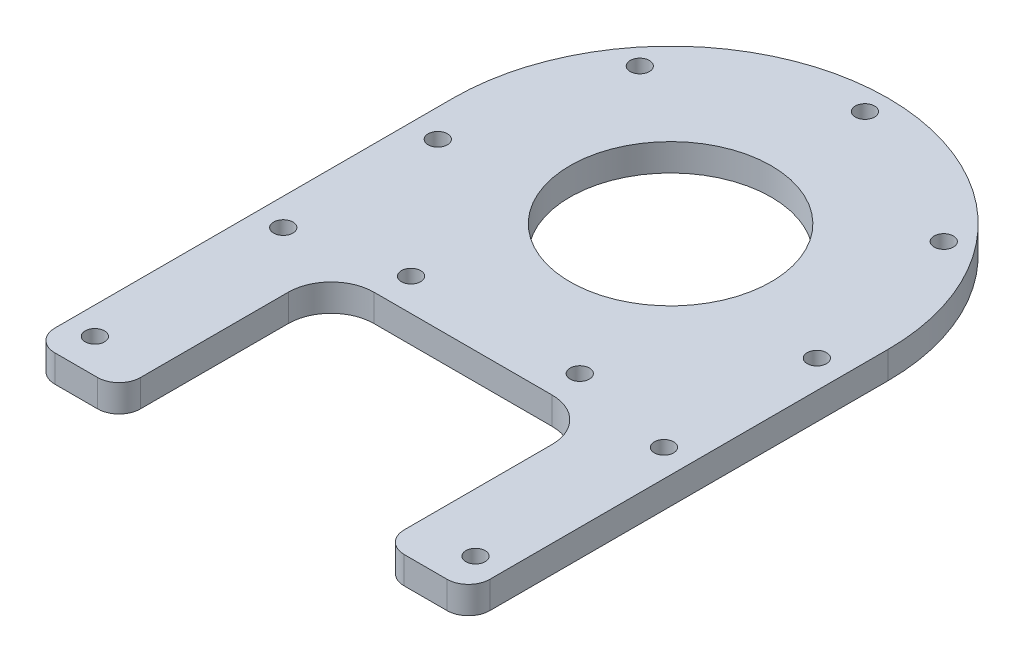
ISO-10303-21;
HEADER;
FILE_DESCRIPTION(('STEP AP214'),'2;1');
FILE_NAME('part.step','',(''),(''),'','','');
FILE_SCHEMA(('AUTOMOTIVE_DESIGN { 1 0 10303 214 1 1 1 1 }'));
ENDSEC;
DATA;
#1=APPLICATION_CONTEXT('core data for automotive mechanical design processes');
#2=APPLICATION_PROTOCOL_DEFINITION('international standard','automotive_design',2000,#1);
#3=PRODUCT_CONTEXT('',#1,'mechanical');
#4=PRODUCT('Part','Part','',(#3));
#5=PRODUCT_RELATED_PRODUCT_CATEGORY('part','',(#4));
#6=PRODUCT_DEFINITION_FORMATION('','',#4);
#7=PRODUCT_DEFINITION_CONTEXT('part definition',#1,'design');
#8=PRODUCT_DEFINITION('design','',#6,#7);
#9=PRODUCT_DEFINITION_SHAPE('','',#8);
#10=(LENGTH_UNIT() NAMED_UNIT(*) SI_UNIT(.MILLI.,.METRE.));
#11=(NAMED_UNIT(*) PLANE_ANGLE_UNIT() SI_UNIT($,.RADIAN.));
#12=(NAMED_UNIT(*) SI_UNIT($,.STERADIAN.) SOLID_ANGLE_UNIT());
#13=UNCERTAINTY_MEASURE_WITH_UNIT(LENGTH_MEASURE(1.E-05),#10,'distance_accuracy_value','');
#14=(GEOMETRIC_REPRESENTATION_CONTEXT(3) GLOBAL_UNCERTAINTY_ASSIGNED_CONTEXT((#13)) GLOBAL_UNIT_ASSIGNED_CONTEXT((#10,
#11,#12)) REPRESENTATION_CONTEXT('',''));
#15=CARTESIAN_POINT('',(0.,0.,0.));
#16=DIRECTION('',(0.,0.,1.));
#17=DIRECTION('',(1.,0.,0.));
#18=AXIS2_PLACEMENT_3D('',#15,#16,#17);
#19=CARTESIAN_POINT('',(0.,6.35,24.0717945408006));
#20=DIRECTION('',(0.,0.,-1.));
#21=DIRECTION('',(-1.,0.,0.));
#22=AXIS2_PLACEMENT_3D('',#19,#20,#21);
#23=PLANE('',#22);
#24=DIRECTION('',(1.,0.,0.));
#25=VECTOR('',#24,1.);
#26=CARTESIAN_POINT('',(0.,0.,24.0717945408006));
#27=LINE('',#26,#25);
#28=CARTESIAN_POINT('',(-20.8,0.,24.0717945408006));
#29=VERTEX_POINT('',#28);
#30=CARTESIAN_POINT('',(20.8,0.,24.0717945408006));
#31=VERTEX_POINT('',#30);
#32=EDGE_CURVE('E183',#29,#31,#27,.T.);
#33=ORIENTED_EDGE('',*,*,#32,.T.);
#34=DIRECTION('',(0.,-1.,0.));
#35=VECTOR('',#34,1.);
#36=CARTESIAN_POINT('',(20.8,6.35,24.0717945408006));
#37=LINE('',#36,#35);
#38=CARTESIAN_POINT('',(20.8,6.35,24.0717945408006));
#39=VERTEX_POINT('',#38);
#40=EDGE_CURVE('E210',#31,#39,#37,.F.);
#41=ORIENTED_EDGE('',*,*,#40,.T.);
#42=DIRECTION('',(1.,0.,0.));
#43=VECTOR('',#42,1.);
#44=CARTESIAN_POINT('',(0.,6.35,24.0717945408006));
#45=LINE('',#44,#43);
#46=CARTESIAN_POINT('',(-20.8,6.35,24.0717945408006));
#47=VERTEX_POINT('',#46);
#48=EDGE_CURVE('E203',#47,#39,#45,.T.);
#49=ORIENTED_EDGE('',*,*,#48,.F.);
#50=DIRECTION('',(0.,-1.,0.));
#51=VECTOR('',#50,1.);
#52=CARTESIAN_POINT('',(-20.8,0.,24.0717945408006));
#53=LINE('',#52,#51);
#54=EDGE_CURVE('E207',#47,#29,#53,.T.);
#55=ORIENTED_EDGE('',*,*,#54,.T.);
#56=EDGE_LOOP('',(#33,#41,#49,#55));
#57=FACE_BOUND('',#56,.T.);
#58=ADVANCED_FACE('F47',(#57),#23,.F.);
#59=CARTESIAN_POINT('',(30.8,6.35,0.));
#60=DIRECTION('',(1.,0.,0.));
#61=DIRECTION('',(0.,0.,-1.));
#62=AXIS2_PLACEMENT_3D('',#59,#60,#61);
#63=PLANE('',#62);
#64=DIRECTION('',(0.,0.,1.));
#65=VECTOR('',#64,1.);
#66=CARTESIAN_POINT('',(30.8,0.,0.));
#67=LINE('',#66,#65);
#68=CARTESIAN_POINT('',(30.8,0.,34.0717945408006));
#69=VERTEX_POINT('',#68);
#70=CARTESIAN_POINT('',(30.8,0.,68.6017945408006));
#71=VERTEX_POINT('',#70);
#72=EDGE_CURVE('E186',#69,#71,#67,.T.);
#73=ORIENTED_EDGE('',*,*,#72,.T.);
#74=DIRECTION('',(0.,-1.,0.));
#75=VECTOR('',#74,1.);
#76=CARTESIAN_POINT('',(30.8,6.35,68.6017945408006));
#77=LINE('',#76,#75);
#78=CARTESIAN_POINT('',(30.8,6.35,68.6017945408006));
#79=VERTEX_POINT('',#78);
#80=EDGE_CURVE('E290',#71,#79,#77,.F.);
#81=ORIENTED_EDGE('',*,*,#80,.T.);
#82=DIRECTION('',(0.,0.,1.));
#83=VECTOR('',#82,1.);
#84=CARTESIAN_POINT('',(30.8,6.35,0.));
#85=LINE('',#84,#83);
#86=CARTESIAN_POINT('',(30.8,6.35,34.0717945408006));
#87=VERTEX_POINT('',#86);
#88=EDGE_CURVE('E331',#87,#79,#85,.T.);
#89=ORIENTED_EDGE('',*,*,#88,.F.);
#90=DIRECTION('',(0.,-1.,0.));
#91=VECTOR('',#90,1.);
#92=CARTESIAN_POINT('',(30.8,0.,34.0717945408006));
#93=LINE('',#92,#91);
#94=EDGE_CURVE('E168',#87,#69,#93,.T.);
#95=ORIENTED_EDGE('',*,*,#94,.T.);
#96=EDGE_LOOP('',(#73,#81,#89,#95));
#97=FACE_BOUND('',#96,.T.);
#98=ADVANCED_FACE('F341',(#97),#63,.F.);
#99=CARTESIAN_POINT('',(0.,6.35,73.6017945408006));
#100=DIRECTION('',(0.,0.,-1.));
#101=DIRECTION('',(-1.,0.,0.));
#102=AXIS2_PLACEMENT_3D('',#99,#100,#101);
#103=PLANE('',#102);
#104=DIRECTION('',(1.,0.,0.));
#105=VECTOR('',#104,1.);
#106=CARTESIAN_POINT('',(0.,6.35,73.6017945408006));
#107=LINE('',#106,#105);
#108=CARTESIAN_POINT('',(35.8,6.35,73.6017945408006));
#109=VERTEX_POINT('',#108);
#110=CARTESIAN_POINT('',(45.8,6.35,73.6017945408006));
#111=VERTEX_POINT('',#110);
#112=EDGE_CURVE('E159',#109,#111,#107,.T.);
#113=ORIENTED_EDGE('',*,*,#112,.F.);
#114=DIRECTION('',(0.,-1.,0.));
#115=VECTOR('',#114,1.);
#116=CARTESIAN_POINT('',(35.8,6.35,73.6017945408006));
#117=LINE('',#116,#115);
#118=CARTESIAN_POINT('',(35.8,0.,73.6017945408006));
#119=VERTEX_POINT('',#118);
#120=EDGE_CURVE('E279',#109,#119,#117,.T.);
#121=ORIENTED_EDGE('',*,*,#120,.T.);
#122=DIRECTION('',(1.,0.,0.));
#123=VECTOR('',#122,1.);
#124=CARTESIAN_POINT('',(0.,0.,73.6017945408006));
#125=LINE('',#124,#123);
#126=CARTESIAN_POINT('',(45.8,0.,73.6017945408006));
#127=VERTEX_POINT('',#126);
#128=EDGE_CURVE('E190',#119,#127,#125,.T.);
#129=ORIENTED_EDGE('',*,*,#128,.T.);
#130=DIRECTION('',(0.,-1.,0.));
#131=VECTOR('',#130,1.);
#132=CARTESIAN_POINT('',(45.8,6.35,73.6017945408006));
#133=LINE('',#132,#131);
#134=EDGE_CURVE('E224',#127,#111,#133,.F.);
#135=ORIENTED_EDGE('',*,*,#134,.T.);
#136=EDGE_LOOP('',(#113,#121,#129,#135));
#137=FACE_BOUND('',#136,.T.);
#138=ADVANCED_FACE('F455',(#137),#103,.F.);
#139=CARTESIAN_POINT('',(50.8,6.35,0.));
#140=DIRECTION('',(-1.,0.,0.));
#141=DIRECTION('',(0.,0.,1.));
#142=AXIS2_PLACEMENT_3D('',#139,#140,#141);
#143=PLANE('',#142);
#144=DIRECTION('',(0.,0.,-1.));
#145=VECTOR('',#144,1.);
#146=CARTESIAN_POINT('',(50.8,6.35,0.));
#147=LINE('',#146,#145);
#148=CARTESIAN_POINT('',(50.8,6.35,68.6017945408006));
#149=VERTEX_POINT('',#148);
#150=CARTESIAN_POINT('',(50.8,6.35,-24.3982054591994));
#151=VERTEX_POINT('',#150);
#152=EDGE_CURVE('E146',#149,#151,#147,.T.);
#153=ORIENTED_EDGE('',*,*,#152,.F.);
#154=DIRECTION('',(0.,-1.,0.));
#155=VECTOR('',#154,1.);
#156=CARTESIAN_POINT('',(50.8,6.35,68.6017945408006));
#157=LINE('',#156,#155);
#158=CARTESIAN_POINT('',(50.8,0.,68.6017945408006));
#159=VERTEX_POINT('',#158);
#160=EDGE_CURVE('E298',#149,#159,#157,.T.);
#161=ORIENTED_EDGE('',*,*,#160,.T.);
#162=DIRECTION('',(0.,0.,-1.));
#163=VECTOR('',#162,1.);
#164=CARTESIAN_POINT('',(50.8,0.,0.));
#165=LINE('',#164,#163);
#166=CARTESIAN_POINT('',(50.8,0.,-24.3982054591994));
#167=VERTEX_POINT('',#166);
#168=EDGE_CURVE('E165',#159,#167,#165,.T.);
#169=ORIENTED_EDGE('',*,*,#168,.T.);
#170=DIRECTION('',(0.,-1.,0.));
#171=VECTOR('',#170,1.);
#172=CARTESIAN_POINT('',(50.8,6.35,-24.3982054591994));
#173=LINE('',#172,#171);
#174=EDGE_CURVE('E162',#151,#167,#173,.T.);
#175=ORIENTED_EDGE('',*,*,#174,.F.);
#176=EDGE_LOOP('',(#153,#161,#169,#175));
#177=FACE_BOUND('',#176,.T.);
#178=ADVANCED_FACE('F163',(#177),#143,.F.);
#179=CARTESIAN_POINT('',(0.,6.35,-24.3982054591994));
#180=DIRECTION('',(0.,-1.,0.));
#181=DIRECTION('',(0.,0.,-1.));
#182=AXIS2_PLACEMENT_3D('',#179,#180,#181);
#183=CYLINDRICAL_SURFACE('',#182,50.8);
#184=CARTESIAN_POINT('',(0.,0.,-24.3982054591994));
#185=DIRECTION('',(0.,1.,0.));
#186=DIRECTION('',(0.,0.,1.));
#187=AXIS2_PLACEMENT_3D('',#184,#185,#186);
#188=CIRCLE('',#187,50.8);
#189=CARTESIAN_POINT('',(-50.8,0.,-24.3982054591994));
#190=VERTEX_POINT('',#189);
#191=EDGE_CURVE('E194',#167,#190,#188,.T.);
#192=ORIENTED_EDGE('',*,*,#191,.T.);
#193=DIRECTION('',(0.,-1.,0.));
#194=VECTOR('',#193,1.);
#195=CARTESIAN_POINT('',(-50.8,6.35,-24.3982054591994));
#196=LINE('',#195,#194);
#197=CARTESIAN_POINT('',(-50.8,6.35,-24.3982054591994));
#198=VERTEX_POINT('',#197);
#199=EDGE_CURVE('E169',#198,#190,#196,.T.);
#200=ORIENTED_EDGE('',*,*,#199,.F.);
#201=CARTESIAN_POINT('',(0.,6.35,-24.3982054591994));
#202=DIRECTION('',(0.,1.,0.));
#203=DIRECTION('',(0.,0.,1.));
#204=AXIS2_PLACEMENT_3D('',#201,#202,#203);
#205=CIRCLE('',#204,50.8);
#206=EDGE_CURVE('E151',#151,#198,#205,.T.);
#207=ORIENTED_EDGE('',*,*,#206,.F.);
#208=ORIENTED_EDGE('',*,*,#174,.T.);
#209=EDGE_LOOP('',(#192,#200,#207,#208));
#210=FACE_BOUND('',#209,.T.);
#211=ADVANCED_FACE('F171',(#210),#183,.T.);
#212=CARTESIAN_POINT('',(-50.8,6.35,0.));
#213=DIRECTION('',(1.,0.,0.));
#214=DIRECTION('',(0.,0.,-1.));
#215=AXIS2_PLACEMENT_3D('',#212,#213,#214);
#216=PLANE('',#215);
#217=DIRECTION('',(0.,0.,1.));
#218=VECTOR('',#217,1.);
#219=CARTESIAN_POINT('',(-50.8,0.,0.));
#220=LINE('',#219,#218);
#221=CARTESIAN_POINT('',(-50.8,0.,68.6017945408006));
#222=VERTEX_POINT('',#221);
#223=EDGE_CURVE('E196',#190,#222,#220,.T.);
#224=ORIENTED_EDGE('',*,*,#223,.T.);
#225=DIRECTION('',(0.,-1.,0.));
#226=VECTOR('',#225,1.);
#227=CARTESIAN_POINT('',(-50.8,6.35,68.6017945408006));
#228=LINE('',#227,#226);
#229=CARTESIAN_POINT('',(-50.8,6.35,68.6017945408006));
#230=VERTEX_POINT('',#229);
#231=EDGE_CURVE('E11',#222,#230,#228,.F.);
#232=ORIENTED_EDGE('',*,*,#231,.T.);
#233=DIRECTION('',(0.,0.,1.));
#234=VECTOR('',#233,1.);
#235=CARTESIAN_POINT('',(-50.8,6.35,0.));
#236=LINE('',#235,#234);
#237=EDGE_CURVE('E174',#198,#230,#236,.T.);
#238=ORIENTED_EDGE('',*,*,#237,.F.);
#239=ORIENTED_EDGE('',*,*,#199,.T.);
#240=EDGE_LOOP('',(#224,#232,#238,#239));
#241=FACE_BOUND('',#240,.T.);
#242=ADVANCED_FACE('F476',(#241),#216,.F.);
#243=CARTESIAN_POINT('',(0.,6.35,73.6017945408006));
#244=DIRECTION('',(0.,0.,-1.));
#245=DIRECTION('',(-1.,0.,0.));
#246=AXIS2_PLACEMENT_3D('',#243,#244,#245);
#247=PLANE('',#246);
#248=DIRECTION('',(1.,0.,0.));
#249=VECTOR('',#248,1.);
#250=CARTESIAN_POINT('',(0.,0.,73.6017945408006));
#251=LINE('',#250,#249);
#252=CARTESIAN_POINT('',(-45.8,0.,73.6017945408006));
#253=VERTEX_POINT('',#252);
#254=CARTESIAN_POINT('',(-35.8,0.,73.6017945408006));
#255=VERTEX_POINT('',#254);
#256=EDGE_CURVE('E199',#253,#255,#251,.T.);
#257=ORIENTED_EDGE('',*,*,#256,.T.);
#258=DIRECTION('',(0.,-1.,0.));
#259=VECTOR('',#258,1.);
#260=CARTESIAN_POINT('',(-35.8,6.35,73.6017945408006));
#261=LINE('',#260,#259);
#262=CARTESIAN_POINT('',(-35.8,6.35,73.6017945408006));
#263=VERTEX_POINT('',#262);
#264=EDGE_CURVE('E55',#255,#263,#261,.F.);
#265=ORIENTED_EDGE('',*,*,#264,.T.);
#266=DIRECTION('',(1.,0.,0.));
#267=VECTOR('',#266,1.);
#268=CARTESIAN_POINT('',(0.,6.35,73.6017945408006));
#269=LINE('',#268,#267);
#270=CARTESIAN_POINT('',(-45.8,6.35,73.6017945408006));
#271=VERTEX_POINT('',#270);
#272=EDGE_CURVE('E176',#271,#263,#269,.T.);
#273=ORIENTED_EDGE('',*,*,#272,.F.);
#274=DIRECTION('',(0.,-1.,0.));
#275=VECTOR('',#274,1.);
#276=CARTESIAN_POINT('',(-45.8,6.35,73.6017945408006));
#277=LINE('',#276,#275);
#278=EDGE_CURVE('E303',#271,#253,#277,.T.);
#279=ORIENTED_EDGE('',*,*,#278,.T.);
#280=EDGE_LOOP('',(#257,#265,#273,#279));
#281=FACE_BOUND('',#280,.T.);
#282=ADVANCED_FACE('F307',(#281),#247,.F.);
#283=CARTESIAN_POINT('',(-30.8,6.35,0.));
#284=DIRECTION('',(-1.,0.,0.));
#285=DIRECTION('',(0.,0.,1.));
#286=AXIS2_PLACEMENT_3D('',#283,#284,#285);
#287=PLANE('',#286);
#288=DIRECTION('',(0.,0.,-1.));
#289=VECTOR('',#288,1.);
#290=CARTESIAN_POINT('',(-30.8,6.35,0.));
#291=LINE('',#290,#289);
#292=CARTESIAN_POINT('',(-30.8,6.35,68.6017945408006));
#293=VERTEX_POINT('',#292);
#294=CARTESIAN_POINT('',(-30.8,6.35,34.0717945408006));
#295=VERTEX_POINT('',#294);
#296=EDGE_CURVE('E181',#293,#295,#291,.T.);
#297=ORIENTED_EDGE('',*,*,#296,.F.);
#298=DIRECTION('',(0.,-1.,0.));
#299=VECTOR('',#298,1.);
#300=CARTESIAN_POINT('',(-30.8,6.35,68.6017945408006));
#301=LINE('',#300,#299);
#302=CARTESIAN_POINT('',(-30.8,0.,68.6017945408006));
#303=VERTEX_POINT('',#302);
#304=EDGE_CURVE('E300',#293,#303,#301,.T.);
#305=ORIENTED_EDGE('',*,*,#304,.T.);
#306=DIRECTION('',(0.,0.,-1.));
#307=VECTOR('',#306,1.);
#308=CARTESIAN_POINT('',(-30.8,0.,0.));
#309=LINE('',#308,#307);
#310=CARTESIAN_POINT('',(-30.8,0.,34.0717945408006));
#311=VERTEX_POINT('',#310);
#312=EDGE_CURVE('E201',#303,#311,#309,.T.);
#313=ORIENTED_EDGE('',*,*,#312,.T.);
#314=DIRECTION('',(0.,-1.,0.));
#315=VECTOR('',#314,1.);
#316=CARTESIAN_POINT('',(-30.8,6.35,34.0717945408006));
#317=LINE('',#316,#315);
#318=EDGE_CURVE('E212',#311,#295,#317,.F.);
#319=ORIENTED_EDGE('',*,*,#318,.T.);
#320=EDGE_LOOP('',(#297,#305,#313,#319));
#321=FACE_BOUND('',#320,.T.);
#322=ADVANCED_FACE('F320',(#321),#287,.F.);
#323=CARTESIAN_POINT('',(0.,6.35,0.));
#324=DIRECTION('',(0.,1.,0.));
#325=DIRECTION('',(0.,0.,1.));
#326=AXIS2_PLACEMENT_3D('',#323,#324,#325);
#327=PLANE('',#326);
#328=CARTESIAN_POINT('',(0.,6.35,-24.3982054591994));
#329=DIRECTION('',(0.,-1.,0.));
#330=DIRECTION('',(0.,0.,-1.));
#331=AXIS2_PLACEMENT_3D('',#328,#329,#330);
#332=CIRCLE('',#331,23.5);
#333=CARTESIAN_POINT('',(0.,6.35,-47.8982054591995));
#334=VERTEX_POINT('',#333);
#335=EDGE_CURVE('E390',#334,#334,#332,.T.);
#336=ORIENTED_EDGE('',*,*,#335,.T.);
#337=EDGE_LOOP('',(#336));
#338=FACE_BOUND('',#337,.T.);
#339=CARTESIAN_POINT('',(-44.45,6.35,65.6017945408006));
#340=DIRECTION('',(0.,1.,0.));
#341=DIRECTION('',(0.,0.,1.));
#342=AXIS2_PLACEMENT_3D('',#339,#340,#341);
#343=CIRCLE('',#342,2.24999999999999);
#344=CARTESIAN_POINT('',(-44.45,6.35,67.8517945408006));
#345=VERTEX_POINT('',#344);
#346=EDGE_CURVE('E273',#345,#345,#343,.T.);
#347=ORIENTED_EDGE('',*,*,#346,.F.);
#348=EDGE_LOOP('',(#347));
#349=FACE_BOUND('',#348,.T.);
#350=CARTESIAN_POINT('',(44.45,6.35,65.6017945408006));
#351=DIRECTION('',(0.,1.,0.));
#352=DIRECTION('',(0.,0.,1.));
#353=AXIS2_PLACEMENT_3D('',#350,#351,#352);
#354=CIRCLE('',#353,2.24999999999999);
#355=CARTESIAN_POINT('',(44.45,6.35,67.8517945408006));
#356=VERTEX_POINT('',#355);
#357=EDGE_CURVE('E268',#356,#356,#354,.T.);
#358=ORIENTED_EDGE('',*,*,#357,.F.);
#359=EDGE_LOOP('',(#358));
#360=FACE_BOUND('',#359,.T.);
#361=CARTESIAN_POINT('',(-44.45,6.35,21.6017945408006));
#362=DIRECTION('',(0.,1.,0.));
#363=DIRECTION('',(0.,0.,1.));
#364=AXIS2_PLACEMENT_3D('',#361,#362,#363);
#365=CIRCLE('',#364,2.24999999999999);
#366=CARTESIAN_POINT('',(-44.45,6.35,23.8517945408005));
#367=VERTEX_POINT('',#366);
#368=EDGE_CURVE('E263',#367,#367,#365,.T.);
#369=ORIENTED_EDGE('',*,*,#368,.F.);
#370=EDGE_LOOP('',(#369));
#371=FACE_BOUND('',#370,.T.);
#372=CARTESIAN_POINT('',(44.45,6.35,21.6017945408006));
#373=DIRECTION('',(0.,1.,0.));
#374=DIRECTION('',(0.,0.,1.));
#375=AXIS2_PLACEMENT_3D('',#372,#373,#374);
#376=CIRCLE('',#375,2.24999999999999);
#377=CARTESIAN_POINT('',(44.45,6.35,23.8517945408005));
#378=VERTEX_POINT('',#377);
#379=EDGE_CURVE('E258',#378,#378,#376,.T.);
#380=ORIENTED_EDGE('',*,*,#379,.F.);
#381=EDGE_LOOP('',(#380));
#382=FACE_BOUND('',#381,.T.);
#383=CARTESIAN_POINT('',(19.6983217559375,6.35,16.5057811435702));
#384=DIRECTION('',(0.,1.,0.));
#385=DIRECTION('',(0.,0.,1.));
#386=AXIS2_PLACEMENT_3D('',#383,#384,#385);
#387=CIRCLE('',#386,2.24999999999999);
#388=CARTESIAN_POINT('',(19.6983217559375,6.35,18.7557811435702));
#389=VERTEX_POINT('',#388);
#390=EDGE_CURVE('E253',#389,#389,#387,.T.);
#391=ORIENTED_EDGE('',*,*,#390,.F.);
#392=EDGE_LOOP('',(#391));
#393=FACE_BOUND('',#392,.T.);
#394=CARTESIAN_POINT('',(-19.6983217559369,6.35,16.5057811435705));
#395=DIRECTION('',(0.,1.,0.));
#396=DIRECTION('',(0.,0.,1.));
#397=AXIS2_PLACEMENT_3D('',#394,#395,#396);
#398=CIRCLE('',#397,2.24999999999999);
#399=CARTESIAN_POINT('',(-19.6983217559369,6.35,18.7557811435705));
#400=VERTEX_POINT('',#399);
#401=EDGE_CURVE('E248',#400,#400,#398,.T.);
#402=ORIENTED_EDGE('',*,*,#401,.F.);
#403=EDGE_LOOP('',(#402));
#404=FACE_BOUND('',#403,.T.);
#405=CARTESIAN_POINT('',(-44.2617272130547,6.35,-14.2957550575826));
#406=DIRECTION('',(0.,1.,0.));
#407=DIRECTION('',(0.,0.,1.));
#408=AXIS2_PLACEMENT_3D('',#405,#406,#407);
#409=CIRCLE('',#408,2.24999999999999);
#410=CARTESIAN_POINT('',(-44.2617272130547,6.35,-12.0457550575826));
#411=VERTEX_POINT('',#410);
#412=EDGE_CURVE('E243',#411,#411,#409,.T.);
#413=ORIENTED_EDGE('',*,*,#412,.F.);
#414=EDGE_LOOP('',(#413));
#415=FACE_BOUND('',#414,.T.);
#416=CARTESIAN_POINT('',(-35.4951493040486,6.35,-52.7046424635859));
#417=DIRECTION('',(0.,1.,0.));
#418=DIRECTION('',(0.,0.,1.));
#419=AXIS2_PLACEMENT_3D('',#416,#417,#418);
#420=CIRCLE('',#419,2.24999999999999);
#421=CARTESIAN_POINT('',(-35.4951493040486,6.35,-50.4546424635859));
#422=VERTEX_POINT('',#421);
#423=EDGE_CURVE('E238',#422,#422,#420,.T.);
#424=ORIENTED_EDGE('',*,*,#423,.F.);
#425=EDGE_LOOP('',(#424));
#426=FACE_BOUND('',#425,.T.);
#427=CARTESIAN_POINT('',(0.,6.35,-69.7982054591995));
#428=DIRECTION('',(0.,1.,0.));
#429=DIRECTION('',(0.,0.,1.));
#430=AXIS2_PLACEMENT_3D('',#427,#428,#429);
#431=CIRCLE('',#430,2.24999999999999);
#432=CARTESIAN_POINT('',(0.,6.35,-67.5482054591995));
#433=VERTEX_POINT('',#432);
#434=EDGE_CURVE('E233',#433,#433,#431,.T.);
#435=ORIENTED_EDGE('',*,*,#434,.F.);
#436=EDGE_LOOP('',(#435));
#437=FACE_BOUND('',#436,.T.);
#438=CARTESIAN_POINT('',(35.4951493040482,6.35,-52.7046424635864));
#439=DIRECTION('',(0.,1.,0.));
#440=DIRECTION('',(0.,0.,1.));
#441=AXIS2_PLACEMENT_3D('',#438,#439,#440);
#442=CIRCLE('',#441,2.24999999999999);
#443=CARTESIAN_POINT('',(35.4951493040482,6.35,-50.4546424635864));
#444=VERTEX_POINT('',#443);
#445=EDGE_CURVE('E228',#444,#444,#442,.T.);
#446=ORIENTED_EDGE('',*,*,#445,.F.);
#447=EDGE_LOOP('',(#446));
#448=FACE_BOUND('',#447,.T.);
#449=CARTESIAN_POINT('',(44.2617272130549,6.35,-14.2957550575832));
#450=DIRECTION('',(0.,1.,0.));
#451=DIRECTION('',(0.,0.,1.));
#452=AXIS2_PLACEMENT_3D('',#449,#450,#451);
#453=CIRCLE('',#452,2.24999999999999);
#454=CARTESIAN_POINT('',(44.2617272130549,6.35,-12.0457550575832));
#455=VERTEX_POINT('',#454);
#456=EDGE_CURVE('E187',#455,#455,#453,.T.);
#457=ORIENTED_EDGE('',*,*,#456,.F.);
#458=EDGE_LOOP('',(#457));
#459=FACE_BOUND('',#458,.T.);
#460=ORIENTED_EDGE('',*,*,#88,.T.);
#461=CARTESIAN_POINT('',(35.8,6.35,68.6017945408006));
#462=DIRECTION('',(0.,1.,0.));
#463=DIRECTION('',(0.,0.,1.));
#464=AXIS2_PLACEMENT_3D('',#461,#462,#463);
#465=CIRCLE('',#464,5.);
#466=EDGE_CURVE('E296',#79,#109,#465,.T.);
#467=ORIENTED_EDGE('',*,*,#466,.T.);
#468=ORIENTED_EDGE('',*,*,#112,.T.);
#469=CARTESIAN_POINT('',(45.8,6.35,68.6017945408006));
#470=DIRECTION('',(0.,1.,0.));
#471=DIRECTION('',(0.,0.,1.));
#472=AXIS2_PLACEMENT_3D('',#469,#470,#471);
#473=CIRCLE('',#472,5.);
#474=EDGE_CURVE('E155',#111,#149,#473,.T.);
#475=ORIENTED_EDGE('',*,*,#474,.T.);
#476=ORIENTED_EDGE('',*,*,#152,.T.);
#477=ORIENTED_EDGE('',*,*,#206,.T.);
#478=ORIENTED_EDGE('',*,*,#237,.T.);
#479=CARTESIAN_POINT('',(-45.8,6.35,68.6017945408006));
#480=DIRECTION('',(0.,1.,0.));
#481=DIRECTION('',(0.,0.,1.));
#482=AXIS2_PLACEMENT_3D('',#479,#480,#481);
#483=CIRCLE('',#482,5.);
#484=EDGE_CURVE('E68',#230,#271,#483,.T.);
#485=ORIENTED_EDGE('',*,*,#484,.T.);
#486=ORIENTED_EDGE('',*,*,#272,.T.);
#487=CARTESIAN_POINT('',(-35.8,6.35,68.6017945408006));
#488=DIRECTION('',(0.,1.,0.));
#489=DIRECTION('',(0.,0.,1.));
#490=AXIS2_PLACEMENT_3D('',#487,#488,#489);
#491=CIRCLE('',#490,5.);
#492=EDGE_CURVE('E293',#263,#293,#491,.T.);
#493=ORIENTED_EDGE('',*,*,#492,.T.);
#494=ORIENTED_EDGE('',*,*,#296,.T.);
#495=CARTESIAN_POINT('',(-20.8,6.35,34.0717945408006));
#496=DIRECTION('',(0.,1.,0.));
#497=DIRECTION('',(0.,0.,1.));
#498=AXIS2_PLACEMENT_3D('',#495,#496,#497);
#499=CIRCLE('',#498,10.);
#500=EDGE_CURVE('E222',#295,#47,#499,.F.);
#501=ORIENTED_EDGE('',*,*,#500,.T.);
#502=ORIENTED_EDGE('',*,*,#48,.T.);
#503=CARTESIAN_POINT('',(20.8,6.35,34.0717945408006));
#504=DIRECTION('',(0.,1.,0.));
#505=DIRECTION('',(0.,0.,1.));
#506=AXIS2_PLACEMENT_3D('',#503,#504,#505);
#507=CIRCLE('',#506,10.);
#508=EDGE_CURVE('E217',#39,#87,#507,.F.);
#509=ORIENTED_EDGE('',*,*,#508,.T.);
#510=EDGE_LOOP('',(#460,#467,#468,#475,#476,#477,#478,#485,#486,#493,#494,#501,#502,#509));
#511=FACE_BOUND('',#510,.T.);
#512=ADVANCED_FACE('F149',(#338,#349,#360,#371,#382,#393,#404,#415,#426,#437,#448,#459,#511),
#327,.T.);
#513=CARTESIAN_POINT('',(0.,0.,0.));
#514=DIRECTION('',(0.,1.,0.));
#515=DIRECTION('',(0.,0.,1.));
#516=AXIS2_PLACEMENT_3D('',#513,#514,#515);
#517=PLANE('',#516);
#518=CARTESIAN_POINT('',(0.,0.,-24.3982054591994));
#519=DIRECTION('',(0.,-1.,0.));
#520=DIRECTION('',(0.,0.,-1.));
#521=AXIS2_PLACEMENT_3D('',#518,#519,#520);
#522=CIRCLE('',#521,23.5);
#523=CARTESIAN_POINT('',(0.,0.,-47.8982054591995));
#524=VERTEX_POINT('',#523);
#525=EDGE_CURVE('E391',#524,#524,#522,.T.);
#526=ORIENTED_EDGE('',*,*,#525,.F.);
#527=EDGE_LOOP('',(#526));
#528=FACE_BOUND('',#527,.T.);
#529=CARTESIAN_POINT('',(-44.45,0.,65.6017945408006));
#530=DIRECTION('',(0.,-1.,0.));
#531=DIRECTION('',(0.,0.,-1.));
#532=AXIS2_PLACEMENT_3D('',#529,#530,#531);
#533=CIRCLE('',#532,4.7);
#534=CARTESIAN_POINT('',(-44.45,0.,60.9017945408006));
#535=VERTEX_POINT('',#534);
#536=EDGE_CURVE('E387',#535,#535,#533,.T.);
#537=ORIENTED_EDGE('',*,*,#536,.F.);
#538=EDGE_LOOP('',(#537));
#539=FACE_BOUND('',#538,.T.);
#540=CARTESIAN_POINT('',(44.45,0.,65.6017945408006));
#541=DIRECTION('',(0.,-1.,0.));
#542=DIRECTION('',(0.,0.,-1.));
#543=AXIS2_PLACEMENT_3D('',#540,#541,#542);
#544=CIRCLE('',#543,4.7);
#545=CARTESIAN_POINT('',(44.45,0.,60.9017945408006));
#546=VERTEX_POINT('',#545);
#547=EDGE_CURVE('E276',#546,#546,#544,.T.);
#548=ORIENTED_EDGE('',*,*,#547,.F.);
#549=EDGE_LOOP('',(#548));
#550=FACE_BOUND('',#549,.T.);
#551=CARTESIAN_POINT('',(-44.45,0.,21.6017945408006));
#552=DIRECTION('',(0.,-1.,0.));
#553=DIRECTION('',(0.,0.,-1.));
#554=AXIS2_PLACEMENT_3D('',#551,#552,#553);
#555=CIRCLE('',#554,4.7);
#556=CARTESIAN_POINT('',(-44.45,0.,16.9017945408005));
#557=VERTEX_POINT('',#556);
#558=EDGE_CURVE('E271',#557,#557,#555,.T.);
#559=ORIENTED_EDGE('',*,*,#558,.F.);
#560=EDGE_LOOP('',(#559));
#561=FACE_BOUND('',#560,.T.);
#562=CARTESIAN_POINT('',(44.45,0.,21.6017945408006));
#563=DIRECTION('',(0.,-1.,0.));
#564=DIRECTION('',(0.,0.,-1.));
#565=AXIS2_PLACEMENT_3D('',#562,#563,#564);
#566=CIRCLE('',#565,4.7);
#567=CARTESIAN_POINT('',(44.45,0.,16.9017945408005));
#568=VERTEX_POINT('',#567);
#569=EDGE_CURVE('E266',#568,#568,#566,.T.);
#570=ORIENTED_EDGE('',*,*,#569,.F.);
#571=EDGE_LOOP('',(#570));
#572=FACE_BOUND('',#571,.T.);
#573=CARTESIAN_POINT('',(19.6983217559375,0.,16.5057811435702));
#574=DIRECTION('',(0.,-1.,0.));
#575=DIRECTION('',(0.,0.,-1.));
#576=AXIS2_PLACEMENT_3D('',#573,#574,#575);
#577=CIRCLE('',#576,4.7);
#578=CARTESIAN_POINT('',(19.6983217559375,0.,11.8057811435702));
#579=VERTEX_POINT('',#578);
#580=EDGE_CURVE('E261',#579,#579,#577,.T.);
#581=ORIENTED_EDGE('',*,*,#580,.F.);
#582=EDGE_LOOP('',(#581));
#583=FACE_BOUND('',#582,.T.);
#584=CARTESIAN_POINT('',(-19.6983217559369,0.,16.5057811435705));
#585=DIRECTION('',(0.,-1.,0.));
#586=DIRECTION('',(0.,0.,-1.));
#587=AXIS2_PLACEMENT_3D('',#584,#585,#586);
#588=CIRCLE('',#587,4.7);
#589=CARTESIAN_POINT('',(-19.6983217559369,0.,11.8057811435705));
#590=VERTEX_POINT('',#589);
#591=EDGE_CURVE('E256',#590,#590,#588,.T.);
#592=ORIENTED_EDGE('',*,*,#591,.F.);
#593=EDGE_LOOP('',(#592));
#594=FACE_BOUND('',#593,.T.);
#595=CARTESIAN_POINT('',(-44.2617272130547,0.,-14.2957550575826));
#596=DIRECTION('',(0.,-1.,0.));
#597=DIRECTION('',(0.,0.,-1.));
#598=AXIS2_PLACEMENT_3D('',#595,#596,#597);
#599=CIRCLE('',#598,4.7);
#600=CARTESIAN_POINT('',(-44.2617272130547,0.,-18.9957550575826));
#601=VERTEX_POINT('',#600);
#602=EDGE_CURVE('E251',#601,#601,#599,.T.);
#603=ORIENTED_EDGE('',*,*,#602,.F.);
#604=EDGE_LOOP('',(#603));
#605=FACE_BOUND('',#604,.T.);
#606=CARTESIAN_POINT('',(-35.4951493040486,0.,-52.7046424635859));
#607=DIRECTION('',(0.,-1.,0.));
#608=DIRECTION('',(0.,0.,-1.));
#609=AXIS2_PLACEMENT_3D('',#606,#607,#608);
#610=CIRCLE('',#609,4.7);
#611=CARTESIAN_POINT('',(-35.4951493040486,0.,-57.4046424635859));
#612=VERTEX_POINT('',#611);
#613=EDGE_CURVE('E246',#612,#612,#610,.T.);
#614=ORIENTED_EDGE('',*,*,#613,.F.);
#615=EDGE_LOOP('',(#614));
#616=FACE_BOUND('',#615,.T.);
#617=CARTESIAN_POINT('',(0.,0.,-69.7982054591995));
#618=DIRECTION('',(0.,-1.,0.));
#619=DIRECTION('',(0.,0.,-1.));
#620=AXIS2_PLACEMENT_3D('',#617,#618,#619);
#621=CIRCLE('',#620,4.7);
#622=CARTESIAN_POINT('',(0.,0.,-74.4982054591994));
#623=VERTEX_POINT('',#622);
#624=EDGE_CURVE('E241',#623,#623,#621,.T.);
#625=ORIENTED_EDGE('',*,*,#624,.F.);
#626=EDGE_LOOP('',(#625));
#627=FACE_BOUND('',#626,.T.);
#628=CARTESIAN_POINT('',(35.4951493040482,0.,-52.7046424635864));
#629=DIRECTION('',(0.,-1.,0.));
#630=DIRECTION('',(0.,0.,-1.));
#631=AXIS2_PLACEMENT_3D('',#628,#629,#630);
#632=CIRCLE('',#631,4.7);
#633=CARTESIAN_POINT('',(35.4951493040482,0.,-57.4046424635864));
#634=VERTEX_POINT('',#633);
#635=EDGE_CURVE('E236',#634,#634,#632,.T.);
#636=ORIENTED_EDGE('',*,*,#635,.F.);
#637=EDGE_LOOP('',(#636));
#638=FACE_BOUND('',#637,.T.);
#639=CARTESIAN_POINT('',(44.2617272130549,0.,-14.2957550575832));
#640=DIRECTION('',(0.,-1.,0.));
#641=DIRECTION('',(0.,0.,-1.));
#642=AXIS2_PLACEMENT_3D('',#639,#640,#641);
#643=CIRCLE('',#642,4.7);
#644=CARTESIAN_POINT('',(44.2617272130549,0.,-18.9957550575832));
#645=VERTEX_POINT('',#644);
#646=EDGE_CURVE('E231',#645,#645,#643,.T.);
#647=ORIENTED_EDGE('',*,*,#646,.F.);
#648=EDGE_LOOP('',(#647));
#649=FACE_BOUND('',#648,.T.);
#650=ORIENTED_EDGE('',*,*,#128,.F.);
#651=CARTESIAN_POINT('',(35.8,0.,68.6017945408006));
#652=DIRECTION('',(0.,1.,0.));
#653=DIRECTION('',(0.,0.,1.));
#654=AXIS2_PLACEMENT_3D('',#651,#652,#653);
#655=CIRCLE('',#654,5.);
#656=EDGE_CURVE('E288',#119,#71,#655,.F.);
#657=ORIENTED_EDGE('',*,*,#656,.T.);
#658=ORIENTED_EDGE('',*,*,#72,.F.);
#659=CARTESIAN_POINT('',(20.8,0.,34.0717945408006));
#660=DIRECTION('',(0.,1.,0.));
#661=DIRECTION('',(0.,0.,1.));
#662=AXIS2_PLACEMENT_3D('',#659,#660,#661);
#663=CIRCLE('',#662,10.);
#664=EDGE_CURVE('E215',#69,#31,#663,.T.);
#665=ORIENTED_EDGE('',*,*,#664,.T.);
#666=ORIENTED_EDGE('',*,*,#32,.F.);
#667=CARTESIAN_POINT('',(-20.8,0.,34.0717945408006));
#668=DIRECTION('',(0.,1.,0.));
#669=DIRECTION('',(0.,0.,1.));
#670=AXIS2_PLACEMENT_3D('',#667,#668,#669);
#671=CIRCLE('',#670,10.);
#672=EDGE_CURVE('E219',#29,#311,#671,.T.);
#673=ORIENTED_EDGE('',*,*,#672,.T.);
#674=ORIENTED_EDGE('',*,*,#312,.F.);
#675=CARTESIAN_POINT('',(-35.8,0.,68.6017945408006));
#676=DIRECTION('',(0.,1.,0.));
#677=DIRECTION('',(0.,0.,1.));
#678=AXIS2_PLACEMENT_3D('',#675,#676,#677);
#679=CIRCLE('',#678,5.);
#680=EDGE_CURVE('E284',#303,#255,#679,.F.);
#681=ORIENTED_EDGE('',*,*,#680,.T.);
#682=ORIENTED_EDGE('',*,*,#256,.F.);
#683=CARTESIAN_POINT('',(-45.8,0.,68.6017945408006));
#684=DIRECTION('',(0.,1.,0.));
#685=DIRECTION('',(0.,0.,1.));
#686=AXIS2_PLACEMENT_3D('',#683,#684,#685);
#687=CIRCLE('',#686,5.);
#688=EDGE_CURVE('E282',#253,#222,#687,.F.);
#689=ORIENTED_EDGE('',*,*,#688,.T.);
#690=ORIENTED_EDGE('',*,*,#223,.F.);
#691=ORIENTED_EDGE('',*,*,#191,.F.);
#692=ORIENTED_EDGE('',*,*,#168,.F.);
#693=CARTESIAN_POINT('',(45.8,0.,68.6017945408006));
#694=DIRECTION('',(0.,1.,0.));
#695=DIRECTION('',(0.,0.,1.));
#696=AXIS2_PLACEMENT_3D('',#693,#694,#695);
#697=CIRCLE('',#696,5.);
#698=EDGE_CURVE('E286',#159,#127,#697,.F.);
#699=ORIENTED_EDGE('',*,*,#698,.T.);
#700=EDGE_LOOP('',(#650,#657,#658,#665,#666,#673,#674,#681,#682,#689,#690,#691,#692,#699));
#701=FACE_BOUND('',#700,.T.);
#702=ADVANCED_FACE('F311',(#528,#539,#550,#561,#572,#583,#594,#605,#616,#627,#638,#649,#701),
#517,.F.);
#703=CARTESIAN_POINT('',(20.8,6.35,34.0717945408006));
#704=DIRECTION('',(0.,1.,0.));
#705=DIRECTION('',(0.,0.,1.));
#706=AXIS2_PLACEMENT_3D('',#703,#704,#705);
#707=CYLINDRICAL_SURFACE('',#706,10.);
#708=ORIENTED_EDGE('',*,*,#508,.F.);
#709=ORIENTED_EDGE('',*,*,#40,.F.);
#710=ORIENTED_EDGE('',*,*,#664,.F.);
#711=ORIENTED_EDGE('',*,*,#94,.F.);
#712=EDGE_LOOP('',(#708,#709,#710,#711));
#713=FACE_BOUND('',#712,.T.);
#714=ADVANCED_FACE('F336',(#713),#707,.F.);
#715=CARTESIAN_POINT('',(-20.8,6.35,34.0717945408006));
#716=DIRECTION('',(0.,1.,0.));
#717=DIRECTION('',(0.,0.,1.));
#718=AXIS2_PLACEMENT_3D('',#715,#716,#717);
#719=CYLINDRICAL_SURFACE('',#718,10.);
#720=ORIENTED_EDGE('',*,*,#500,.F.);
#721=ORIENTED_EDGE('',*,*,#318,.F.);
#722=ORIENTED_EDGE('',*,*,#672,.F.);
#723=ORIENTED_EDGE('',*,*,#54,.F.);
#724=EDGE_LOOP('',(#720,#721,#722,#723));
#725=FACE_BOUND('',#724,.T.);
#726=ADVANCED_FACE('F333',(#725),#719,.F.);
#727=CARTESIAN_POINT('',(44.2617272130549,0.,-14.2957550575832));
#728=DIRECTION('',(0.,-1.,0.));
#729=DIRECTION('',(0.,0.,-1.));
#730=AXIS2_PLACEMENT_3D('',#727,#728,#729);
#731=CYLINDRICAL_SURFACE('',#730,2.24999999999999);
#732=ORIENTED_EDGE('',*,*,#456,.T.);
#733=EDGE_LOOP('',(#732));
#734=FACE_BOUND('',#733,.T.);
#735=CARTESIAN_POINT('',(44.2617272130549,2.45,-14.2957550575832));
#736=DIRECTION('',(0.,-1.,0.));
#737=DIRECTION('',(0.,0.,-1.));
#738=AXIS2_PLACEMENT_3D('',#735,#736,#737);
#739=CIRCLE('',#738,2.25);
#740=CARTESIAN_POINT('',(44.2617272130549,2.45,-16.5457550575832));
#741=VERTEX_POINT('',#740);
#742=EDGE_CURVE('E227',#741,#741,#739,.T.);
#743=ORIENTED_EDGE('',*,*,#742,.T.);
#744=EDGE_LOOP('',(#743));
#745=FACE_BOUND('',#744,.T.);
#746=ADVANCED_FACE('F435',(#734,#745),#731,.F.);
#747=CARTESIAN_POINT('',(44.2617272130549,0.,-14.2957550575832));
#748=DIRECTION('',(0.,-1.,0.));
#749=DIRECTION('',(0.,0.,-1.));
#750=AXIS2_PLACEMENT_3D('',#747,#748,#749);
#751=CONICAL_SURFACE('',#750,4.7,0.78539816339745);
#752=ORIENTED_EDGE('',*,*,#742,.F.);
#753=EDGE_LOOP('',(#752));
#754=FACE_BOUND('',#753,.T.);
#755=ORIENTED_EDGE('',*,*,#646,.T.);
#756=EDGE_LOOP('',(#755));
#757=FACE_BOUND('',#756,.T.);
#758=ADVANCED_FACE('F432',(#754,#757),#751,.F.);
#759=CARTESIAN_POINT('',(35.4951493040482,0.,-52.7046424635864));
#760=DIRECTION('',(0.,-1.,0.));
#761=DIRECTION('',(0.,0.,-1.));
#762=AXIS2_PLACEMENT_3D('',#759,#760,#761);
#763=CYLINDRICAL_SURFACE('',#762,2.24999999999999);
#764=ORIENTED_EDGE('',*,*,#445,.T.);
#765=EDGE_LOOP('',(#764));
#766=FACE_BOUND('',#765,.T.);
#767=CARTESIAN_POINT('',(35.4951493040482,2.45,-52.7046424635864));
#768=DIRECTION('',(0.,-1.,0.));
#769=DIRECTION('',(0.,0.,-1.));
#770=AXIS2_PLACEMENT_3D('',#767,#768,#769);
#771=CIRCLE('',#770,2.25);
#772=CARTESIAN_POINT('',(35.4951493040482,2.45,-54.9546424635864));
#773=VERTEX_POINT('',#772);
#774=EDGE_CURVE('E232',#773,#773,#771,.T.);
#775=ORIENTED_EDGE('',*,*,#774,.T.);
#776=EDGE_LOOP('',(#775));
#777=FACE_BOUND('',#776,.T.);
#778=ADVANCED_FACE('F434',(#766,#777),#763,.F.);
#779=CARTESIAN_POINT('',(35.4951493040482,0.,-52.7046424635864));
#780=DIRECTION('',(0.,-1.,0.));
#781=DIRECTION('',(0.,0.,-1.));
#782=AXIS2_PLACEMENT_3D('',#779,#780,#781);
#783=CONICAL_SURFACE('',#782,4.7,0.78539816339745);
#784=ORIENTED_EDGE('',*,*,#774,.F.);
#785=EDGE_LOOP('',(#784));
#786=FACE_BOUND('',#785,.T.);
#787=ORIENTED_EDGE('',*,*,#635,.T.);
#788=EDGE_LOOP('',(#787));
#789=FACE_BOUND('',#788,.T.);
#790=ADVANCED_FACE('F442',(#786,#789),#783,.F.);
#791=CARTESIAN_POINT('',(0.,0.,-69.7982054591995));
#792=DIRECTION('',(0.,-1.,0.));
#793=DIRECTION('',(0.,0.,-1.));
#794=AXIS2_PLACEMENT_3D('',#791,#792,#793);
#795=CYLINDRICAL_SURFACE('',#794,2.24999999999999);
#796=ORIENTED_EDGE('',*,*,#434,.T.);
#797=EDGE_LOOP('',(#796));
#798=FACE_BOUND('',#797,.T.);
#799=CARTESIAN_POINT('',(0.,2.45,-69.7982054591995));
#800=DIRECTION('',(0.,-1.,0.));
#801=DIRECTION('',(0.,0.,-1.));
#802=AXIS2_PLACEMENT_3D('',#799,#800,#801);
#803=CIRCLE('',#802,2.25);
#804=CARTESIAN_POINT('',(0.,2.45,-72.0482054591994));
#805=VERTEX_POINT('',#804);
#806=EDGE_CURVE('E237',#805,#805,#803,.T.);
#807=ORIENTED_EDGE('',*,*,#806,.T.);
#808=EDGE_LOOP('',(#807));
#809=FACE_BOUND('',#808,.T.);
#810=ADVANCED_FACE('F683',(#798,#809),#795,.F.);
#811=CARTESIAN_POINT('',(0.,0.,-69.7982054591995));
#812=DIRECTION('',(0.,-1.,0.));
#813=DIRECTION('',(0.,0.,-1.));
#814=AXIS2_PLACEMENT_3D('',#811,#812,#813);
#815=CONICAL_SURFACE('',#814,4.7,0.785398163397449);
#816=ORIENTED_EDGE('',*,*,#806,.F.);
#817=EDGE_LOOP('',(#816));
#818=FACE_BOUND('',#817,.T.);
#819=ORIENTED_EDGE('',*,*,#624,.T.);
#820=EDGE_LOOP('',(#819));
#821=FACE_BOUND('',#820,.T.);
#822=ADVANCED_FACE('F674',(#818,#821),#815,.F.);
#823=CARTESIAN_POINT('',(-35.4951493040486,0.,-52.7046424635859));
#824=DIRECTION('',(0.,-1.,0.));
#825=DIRECTION('',(0.,0.,-1.));
#826=AXIS2_PLACEMENT_3D('',#823,#824,#825);
#827=CYLINDRICAL_SURFACE('',#826,2.24999999999999);
#828=ORIENTED_EDGE('',*,*,#423,.T.);
#829=EDGE_LOOP('',(#828));
#830=FACE_BOUND('',#829,.T.);
#831=CARTESIAN_POINT('',(-35.4951493040486,2.45,-52.7046424635859));
#832=DIRECTION('',(0.,-1.,0.));
#833=DIRECTION('',(0.,0.,-1.));
#834=AXIS2_PLACEMENT_3D('',#831,#832,#833);
#835=CIRCLE('',#834,2.25);
#836=CARTESIAN_POINT('',(-35.4951493040486,2.45,-54.9546424635859));
#837=VERTEX_POINT('',#836);
#838=EDGE_CURVE('E242',#837,#837,#835,.T.);
#839=ORIENTED_EDGE('',*,*,#838,.T.);
#840=EDGE_LOOP('',(#839));
#841=FACE_BOUND('',#840,.T.);
#842=ADVANCED_FACE('F665',(#830,#841),#827,.F.);
#843=CARTESIAN_POINT('',(-35.4951493040486,0.,-52.7046424635859));
#844=DIRECTION('',(0.,-1.,0.));
#845=DIRECTION('',(0.,0.,-1.));
#846=AXIS2_PLACEMENT_3D('',#843,#844,#845);
#847=CONICAL_SURFACE('',#846,4.7,0.785398163397449);
#848=ORIENTED_EDGE('',*,*,#838,.F.);
#849=EDGE_LOOP('',(#848));
#850=FACE_BOUND('',#849,.T.);
#851=ORIENTED_EDGE('',*,*,#613,.T.);
#852=EDGE_LOOP('',(#851));
#853=FACE_BOUND('',#852,.T.);
#854=ADVANCED_FACE('F656',(#850,#853),#847,.F.);
#855=CARTESIAN_POINT('',(-44.2617272130547,0.,-14.2957550575826));
#856=DIRECTION('',(0.,-1.,0.));
#857=DIRECTION('',(0.,0.,-1.));
#858=AXIS2_PLACEMENT_3D('',#855,#856,#857);
#859=CYLINDRICAL_SURFACE('',#858,2.24999999999999);
#860=ORIENTED_EDGE('',*,*,#412,.T.);
#861=EDGE_LOOP('',(#860));
#862=FACE_BOUND('',#861,.T.);
#863=CARTESIAN_POINT('',(-44.2617272130547,2.45,-14.2957550575826));
#864=DIRECTION('',(0.,-1.,0.));
#865=DIRECTION('',(0.,0.,-1.));
#866=AXIS2_PLACEMENT_3D('',#863,#864,#865);
#867=CIRCLE('',#866,2.25);
#868=CARTESIAN_POINT('',(-44.2617272130547,2.45,-16.5457550575826));
#869=VERTEX_POINT('',#868);
#870=EDGE_CURVE('E247',#869,#869,#867,.T.);
#871=ORIENTED_EDGE('',*,*,#870,.T.);
#872=EDGE_LOOP('',(#871));
#873=FACE_BOUND('',#872,.T.);
#874=ADVANCED_FACE('F647',(#862,#873),#859,.F.);
#875=CARTESIAN_POINT('',(-44.2617272130547,0.,-14.2957550575826));
#876=DIRECTION('',(0.,-1.,0.));
#877=DIRECTION('',(0.,0.,-1.));
#878=AXIS2_PLACEMENT_3D('',#875,#876,#877);
#879=CONICAL_SURFACE('',#878,4.7,0.78539816339745);
#880=ORIENTED_EDGE('',*,*,#870,.F.);
#881=EDGE_LOOP('',(#880));
#882=FACE_BOUND('',#881,.T.);
#883=ORIENTED_EDGE('',*,*,#602,.T.);
#884=EDGE_LOOP('',(#883));
#885=FACE_BOUND('',#884,.T.);
#886=ADVANCED_FACE('F638',(#882,#885),#879,.F.);
#887=CARTESIAN_POINT('',(-19.6983217559369,0.,16.5057811435705));
#888=DIRECTION('',(0.,-1.,0.));
#889=DIRECTION('',(0.,0.,-1.));
#890=AXIS2_PLACEMENT_3D('',#887,#888,#889);
#891=CYLINDRICAL_SURFACE('',#890,2.24999999999999);
#892=ORIENTED_EDGE('',*,*,#401,.T.);
#893=EDGE_LOOP('',(#892));
#894=FACE_BOUND('',#893,.T.);
#895=CARTESIAN_POINT('',(-19.6983217559369,2.45,16.5057811435705));
#896=DIRECTION('',(0.,-1.,0.));
#897=DIRECTION('',(0.,0.,-1.));
#898=AXIS2_PLACEMENT_3D('',#895,#896,#897);
#899=CIRCLE('',#898,2.25);
#900=CARTESIAN_POINT('',(-19.6983217559369,2.45,14.2557811435705));
#901=VERTEX_POINT('',#900);
#902=EDGE_CURVE('E252',#901,#901,#899,.T.);
#903=ORIENTED_EDGE('',*,*,#902,.T.);
#904=EDGE_LOOP('',(#903));
#905=FACE_BOUND('',#904,.T.);
#906=ADVANCED_FACE('F629',(#894,#905),#891,.F.);
#907=CARTESIAN_POINT('',(-19.6983217559369,0.,16.5057811435705));
#908=DIRECTION('',(0.,-1.,0.));
#909=DIRECTION('',(0.,0.,-1.));
#910=AXIS2_PLACEMENT_3D('',#907,#908,#909);
#911=CONICAL_SURFACE('',#910,4.7,0.785398163397449);
#912=ORIENTED_EDGE('',*,*,#902,.F.);
#913=EDGE_LOOP('',(#912));
#914=FACE_BOUND('',#913,.T.);
#915=ORIENTED_EDGE('',*,*,#591,.T.);
#916=EDGE_LOOP('',(#915));
#917=FACE_BOUND('',#916,.T.);
#918=ADVANCED_FACE('F620',(#914,#917),#911,.F.);
#919=CARTESIAN_POINT('',(19.6983217559375,0.,16.5057811435702));
#920=DIRECTION('',(0.,-1.,0.));
#921=DIRECTION('',(0.,0.,-1.));
#922=AXIS2_PLACEMENT_3D('',#919,#920,#921);
#923=CYLINDRICAL_SURFACE('',#922,2.24999999999999);
#924=ORIENTED_EDGE('',*,*,#390,.T.);
#925=EDGE_LOOP('',(#924));
#926=FACE_BOUND('',#925,.T.);
#927=CARTESIAN_POINT('',(19.6983217559375,2.45,16.5057811435702));
#928=DIRECTION('',(0.,-1.,0.));
#929=DIRECTION('',(0.,0.,-1.));
#930=AXIS2_PLACEMENT_3D('',#927,#928,#929);
#931=CIRCLE('',#930,2.25);
#932=CARTESIAN_POINT('',(19.6983217559375,2.45,14.2557811435702));
#933=VERTEX_POINT('',#932);
#934=EDGE_CURVE('E257',#933,#933,#931,.T.);
#935=ORIENTED_EDGE('',*,*,#934,.T.);
#936=EDGE_LOOP('',(#935));
#937=FACE_BOUND('',#936,.T.);
#938=ADVANCED_FACE('F611',(#926,#937),#923,.F.);
#939=CARTESIAN_POINT('',(19.6983217559375,0.,16.5057811435702));
#940=DIRECTION('',(0.,-1.,0.));
#941=DIRECTION('',(0.,0.,-1.));
#942=AXIS2_PLACEMENT_3D('',#939,#940,#941);
#943=CONICAL_SURFACE('',#942,4.7,0.785398163397449);
#944=ORIENTED_EDGE('',*,*,#934,.F.);
#945=EDGE_LOOP('',(#944));
#946=FACE_BOUND('',#945,.T.);
#947=ORIENTED_EDGE('',*,*,#580,.T.);
#948=EDGE_LOOP('',(#947));
#949=FACE_BOUND('',#948,.T.);
#950=ADVANCED_FACE('F602',(#946,#949),#943,.F.);
#951=CARTESIAN_POINT('',(44.45,0.,21.6017945408006));
#952=DIRECTION('',(0.,-1.,0.));
#953=DIRECTION('',(0.,0.,-1.));
#954=AXIS2_PLACEMENT_3D('',#951,#952,#953);
#955=CYLINDRICAL_SURFACE('',#954,2.24999999999999);
#956=ORIENTED_EDGE('',*,*,#379,.T.);
#957=EDGE_LOOP('',(#956));
#958=FACE_BOUND('',#957,.T.);
#959=CARTESIAN_POINT('',(44.45,2.45,21.6017945408006));
#960=DIRECTION('',(0.,-1.,0.));
#961=DIRECTION('',(0.,0.,-1.));
#962=AXIS2_PLACEMENT_3D('',#959,#960,#961);
#963=CIRCLE('',#962,2.25);
#964=CARTESIAN_POINT('',(44.45,2.45,19.3517945408006));
#965=VERTEX_POINT('',#964);
#966=EDGE_CURVE('E262',#965,#965,#963,.T.);
#967=ORIENTED_EDGE('',*,*,#966,.T.);
#968=EDGE_LOOP('',(#967));
#969=FACE_BOUND('',#968,.T.);
#970=ADVANCED_FACE('F593',(#958,#969),#955,.F.);
#971=CARTESIAN_POINT('',(44.45,0.,21.6017945408006));
#972=DIRECTION('',(0.,-1.,0.));
#973=DIRECTION('',(0.,0.,-1.));
#974=AXIS2_PLACEMENT_3D('',#971,#972,#973);
#975=CONICAL_SURFACE('',#974,4.7,0.78539816339745);
#976=ORIENTED_EDGE('',*,*,#966,.F.);
#977=EDGE_LOOP('',(#976));
#978=FACE_BOUND('',#977,.T.);
#979=ORIENTED_EDGE('',*,*,#569,.T.);
#980=EDGE_LOOP('',(#979));
#981=FACE_BOUND('',#980,.T.);
#982=ADVANCED_FACE('F584',(#978,#981),#975,.F.);
#983=CARTESIAN_POINT('',(-44.45,0.,21.6017945408006));
#984=DIRECTION('',(0.,-1.,0.));
#985=DIRECTION('',(0.,0.,-1.));
#986=AXIS2_PLACEMENT_3D('',#983,#984,#985);
#987=CYLINDRICAL_SURFACE('',#986,2.24999999999999);
#988=ORIENTED_EDGE('',*,*,#368,.T.);
#989=EDGE_LOOP('',(#988));
#990=FACE_BOUND('',#989,.T.);
#991=CARTESIAN_POINT('',(-44.45,2.45,21.6017945408006));
#992=DIRECTION('',(0.,-1.,0.));
#993=DIRECTION('',(0.,0.,-1.));
#994=AXIS2_PLACEMENT_3D('',#991,#992,#993);
#995=CIRCLE('',#994,2.25);
#996=CARTESIAN_POINT('',(-44.45,2.45,19.3517945408006));
#997=VERTEX_POINT('',#996);
#998=EDGE_CURVE('E267',#997,#997,#995,.T.);
#999=ORIENTED_EDGE('',*,*,#998,.T.);
#1000=EDGE_LOOP('',(#999));
#1001=FACE_BOUND('',#1000,.T.);
#1002=ADVANCED_FACE('F575',(#990,#1001),#987,.F.);
#1003=CARTESIAN_POINT('',(-44.45,0.,21.6017945408006));
#1004=DIRECTION('',(0.,-1.,0.));
#1005=DIRECTION('',(0.,0.,-1.));
#1006=AXIS2_PLACEMENT_3D('',#1003,#1004,#1005);
#1007=CONICAL_SURFACE('',#1006,4.7,0.78539816339745);
#1008=ORIENTED_EDGE('',*,*,#998,.F.);
#1009=EDGE_LOOP('',(#1008));
#1010=FACE_BOUND('',#1009,.T.);
#1011=ORIENTED_EDGE('',*,*,#558,.T.);
#1012=EDGE_LOOP('',(#1011));
#1013=FACE_BOUND('',#1012,.T.);
#1014=ADVANCED_FACE('F566',(#1010,#1013),#1007,.F.);
#1015=CARTESIAN_POINT('',(44.45,0.,65.6017945408006));
#1016=DIRECTION('',(0.,-1.,0.));
#1017=DIRECTION('',(0.,0.,-1.));
#1018=AXIS2_PLACEMENT_3D('',#1015,#1016,#1017);
#1019=CYLINDRICAL_SURFACE('',#1018,2.24999999999999);
#1020=ORIENTED_EDGE('',*,*,#357,.T.);
#1021=EDGE_LOOP('',(#1020));
#1022=FACE_BOUND('',#1021,.T.);
#1023=CARTESIAN_POINT('',(44.45,2.45,65.6017945408006));
#1024=DIRECTION('',(0.,-1.,0.));
#1025=DIRECTION('',(0.,0.,-1.));
#1026=AXIS2_PLACEMENT_3D('',#1023,#1024,#1025);
#1027=CIRCLE('',#1026,2.25);
#1028=CARTESIAN_POINT('',(44.45,2.45,63.3517945408006));
#1029=VERTEX_POINT('',#1028);
#1030=EDGE_CURVE('E272',#1029,#1029,#1027,.T.);
#1031=ORIENTED_EDGE('',*,*,#1030,.T.);
#1032=EDGE_LOOP('',(#1031));
#1033=FACE_BOUND('',#1032,.T.);
#1034=ADVANCED_FACE('F557',(#1022,#1033),#1019,.F.);
#1035=CARTESIAN_POINT('',(44.45,0.,65.6017945408006));
#1036=DIRECTION('',(0.,-1.,0.));
#1037=DIRECTION('',(0.,0.,-1.));
#1038=AXIS2_PLACEMENT_3D('',#1035,#1036,#1037);
#1039=CONICAL_SURFACE('',#1038,4.7,0.78539816339745);
#1040=ORIENTED_EDGE('',*,*,#1030,.F.);
#1041=EDGE_LOOP('',(#1040));
#1042=FACE_BOUND('',#1041,.T.);
#1043=ORIENTED_EDGE('',*,*,#547,.T.);
#1044=EDGE_LOOP('',(#1043));
#1045=FACE_BOUND('',#1044,.T.);
#1046=ADVANCED_FACE('F548',(#1042,#1045),#1039,.F.);
#1047=CARTESIAN_POINT('',(-44.45,0.,65.6017945408006));
#1048=DIRECTION('',(0.,-1.,0.));
#1049=DIRECTION('',(0.,0.,-1.));
#1050=AXIS2_PLACEMENT_3D('',#1047,#1048,#1049);
#1051=CYLINDRICAL_SURFACE('',#1050,2.24999999999999);
#1052=ORIENTED_EDGE('',*,*,#346,.T.);
#1053=EDGE_LOOP('',(#1052));
#1054=FACE_BOUND('',#1053,.T.);
#1055=CARTESIAN_POINT('',(-44.45,2.45,65.6017945408006));
#1056=DIRECTION('',(0.,-1.,0.));
#1057=DIRECTION('',(0.,0.,-1.));
#1058=AXIS2_PLACEMENT_3D('',#1055,#1056,#1057);
#1059=CIRCLE('',#1058,2.25);
#1060=CARTESIAN_POINT('',(-44.45,2.45,63.3517945408006));
#1061=VERTEX_POINT('',#1060);
#1062=EDGE_CURVE('E277',#1061,#1061,#1059,.T.);
#1063=ORIENTED_EDGE('',*,*,#1062,.T.);
#1064=EDGE_LOOP('',(#1063));
#1065=FACE_BOUND('',#1064,.T.);
#1066=ADVANCED_FACE('F539',(#1054,#1065),#1051,.F.);
#1067=CARTESIAN_POINT('',(-44.45,0.,65.6017945408006));
#1068=DIRECTION('',(0.,-1.,0.));
#1069=DIRECTION('',(0.,0.,-1.));
#1070=AXIS2_PLACEMENT_3D('',#1067,#1068,#1069);
#1071=CONICAL_SURFACE('',#1070,4.7,0.78539816339745);
#1072=ORIENTED_EDGE('',*,*,#1062,.F.);
#1073=EDGE_LOOP('',(#1072));
#1074=FACE_BOUND('',#1073,.T.);
#1075=ORIENTED_EDGE('',*,*,#536,.T.);
#1076=EDGE_LOOP('',(#1075));
#1077=FACE_BOUND('',#1076,.T.);
#1078=ADVANCED_FACE('F403',(#1074,#1077),#1071,.F.);
#1079=CARTESIAN_POINT('',(0.,6.35,-24.3982054591994));
#1080=DIRECTION('',(0.,-1.,0.));
#1081=DIRECTION('',(0.,0.,-1.));
#1082=AXIS2_PLACEMENT_3D('',#1079,#1080,#1081);
#1083=CYLINDRICAL_SURFACE('',#1082,23.5);
#1084=ORIENTED_EDGE('',*,*,#335,.F.);
#1085=EDGE_LOOP('',(#1084));
#1086=FACE_BOUND('',#1085,.T.);
#1087=ORIENTED_EDGE('',*,*,#525,.T.);
#1088=EDGE_LOOP('',(#1087));
#1089=FACE_BOUND('',#1088,.T.);
#1090=ADVANCED_FACE('F399',(#1086,#1089),#1083,.F.);
#1091=CARTESIAN_POINT('',(35.8,6.35,68.6017945408006));
#1092=DIRECTION('',(0.,-1.,0.));
#1093=DIRECTION('',(0.,0.,-1.));
#1094=AXIS2_PLACEMENT_3D('',#1091,#1092,#1093);
#1095=CYLINDRICAL_SURFACE('',#1094,5.);
#1096=ORIENTED_EDGE('',*,*,#466,.F.);
#1097=ORIENTED_EDGE('',*,*,#80,.F.);
#1098=ORIENTED_EDGE('',*,*,#656,.F.);
#1099=ORIENTED_EDGE('',*,*,#120,.F.);
#1100=EDGE_LOOP('',(#1096,#1097,#1098,#1099));
#1101=FACE_BOUND('',#1100,.T.);
#1102=ADVANCED_FACE('F402',(#1101),#1095,.T.);
#1103=CARTESIAN_POINT('',(45.8,6.35,68.6017945408006));
#1104=DIRECTION('',(0.,-1.,0.));
#1105=DIRECTION('',(0.,0.,-1.));
#1106=AXIS2_PLACEMENT_3D('',#1103,#1104,#1105);
#1107=CYLINDRICAL_SURFACE('',#1106,5.);
#1108=ORIENTED_EDGE('',*,*,#474,.F.);
#1109=ORIENTED_EDGE('',*,*,#134,.F.);
#1110=ORIENTED_EDGE('',*,*,#698,.F.);
#1111=ORIENTED_EDGE('',*,*,#160,.F.);
#1112=EDGE_LOOP('',(#1108,#1109,#1110,#1111));
#1113=FACE_BOUND('',#1112,.T.);
#1114=ADVANCED_FACE('F464',(#1113),#1107,.T.);
#1115=CARTESIAN_POINT('',(-35.8,6.35,68.6017945408006));
#1116=DIRECTION('',(0.,-1.,0.));
#1117=DIRECTION('',(0.,0.,-1.));
#1118=AXIS2_PLACEMENT_3D('',#1115,#1116,#1117);
#1119=CYLINDRICAL_SURFACE('',#1118,5.);
#1120=ORIENTED_EDGE('',*,*,#492,.F.);
#1121=ORIENTED_EDGE('',*,*,#264,.F.);
#1122=ORIENTED_EDGE('',*,*,#680,.F.);
#1123=ORIENTED_EDGE('',*,*,#304,.F.);
#1124=EDGE_LOOP('',(#1120,#1121,#1122,#1123));
#1125=FACE_BOUND('',#1124,.T.);
#1126=ADVANCED_FACE('F317',(#1125),#1119,.T.);
#1127=CARTESIAN_POINT('',(-45.8,6.35,68.6017945408006));
#1128=DIRECTION('',(0.,-1.,0.));
#1129=DIRECTION('',(0.,0.,-1.));
#1130=AXIS2_PLACEMENT_3D('',#1127,#1128,#1129);
#1131=CYLINDRICAL_SURFACE('',#1130,5.);
#1132=ORIENTED_EDGE('',*,*,#484,.F.);
#1133=ORIENTED_EDGE('',*,*,#231,.F.);
#1134=ORIENTED_EDGE('',*,*,#688,.F.);
#1135=ORIENTED_EDGE('',*,*,#278,.F.);
#1136=EDGE_LOOP('',(#1132,#1133,#1134,#1135));
#1137=FACE_BOUND('',#1136,.T.);
#1138=ADVANCED_FACE('F49',(#1137),#1131,.T.);
#1139=CLOSED_SHELL('',(#58,#98,#138,#178,#211,#242,#282,#322,#512,#702,#714,#726,#746,#758,#778,
#790,#810,#822,#842,#854,#874,#886,#906,#918,#938,#950,#970,#982,#1002,#1014,#1034,#1046,#1066,
#1078,#1090,#1102,#1114,#1126,#1138));
#1140=MANIFOLD_SOLID_BREP('B2',#1139);
#1141=ADVANCED_BREP_SHAPE_REPRESENTATION('',(#18,#1140),#14);
#1142=SHAPE_DEFINITION_REPRESENTATION(#9,#1141);
ENDSEC;
END-ISO-10303-21;
